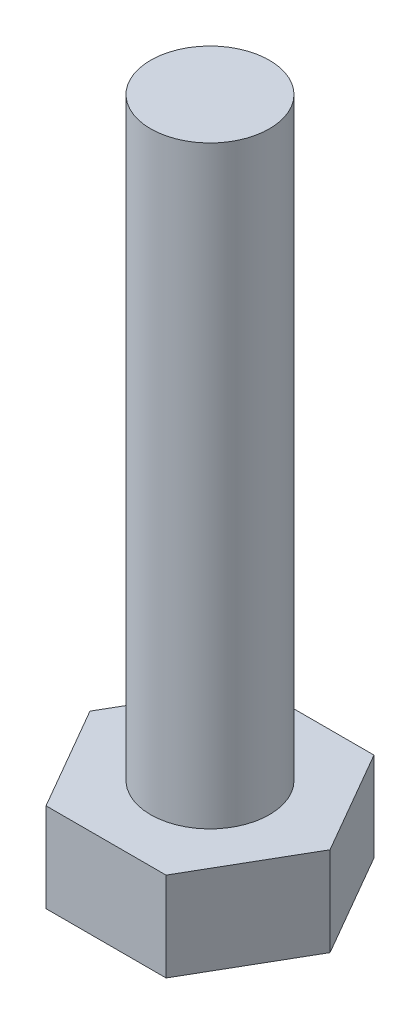
ISO-10303-21;
HEADER;
FILE_DESCRIPTION(('STEP AP214'),'2;1');
FILE_NAME('part.step','',(''),(''),'','','');
FILE_SCHEMA(('AUTOMOTIVE_DESIGN { 1 0 10303 214 1 1 1 1 }'));
ENDSEC;
DATA;
#1=APPLICATION_CONTEXT('core data for automotive mechanical design processes');
#2=APPLICATION_PROTOCOL_DEFINITION('international standard','automotive_design',2000,#1);
#3=PRODUCT_CONTEXT('',#1,'mechanical');
#4=PRODUCT('Part','Part','',(#3));
#5=PRODUCT_RELATED_PRODUCT_CATEGORY('part','',(#4));
#6=PRODUCT_DEFINITION_FORMATION('','',#4);
#7=PRODUCT_DEFINITION_CONTEXT('part definition',#1,'design');
#8=PRODUCT_DEFINITION('design','',#6,#7);
#9=PRODUCT_DEFINITION_SHAPE('','',#8);
#10=(LENGTH_UNIT() NAMED_UNIT(*) SI_UNIT(.MILLI.,.METRE.));
#11=(NAMED_UNIT(*) PLANE_ANGLE_UNIT() SI_UNIT($,.RADIAN.));
#12=(NAMED_UNIT(*) SI_UNIT($,.STERADIAN.) SOLID_ANGLE_UNIT());
#13=UNCERTAINTY_MEASURE_WITH_UNIT(LENGTH_MEASURE(1.E-05),#10,'distance_accuracy_value','');
#14=(GEOMETRIC_REPRESENTATION_CONTEXT(3) GLOBAL_UNCERTAINTY_ASSIGNED_CONTEXT((#13)) GLOBAL_UNIT_ASSIGNED_CONTEXT((#10,
#11,#12)) REPRESENTATION_CONTEXT('',''));
#15=CARTESIAN_POINT('',(0.,0.,0.));
#16=DIRECTION('',(0.,0.,1.));
#17=DIRECTION('',(1.,0.,0.));
#18=AXIS2_PLACEMENT_3D('',#15,#16,#17);
#19=CARTESIAN_POINT('',(-2.02072594216373,3.,-3.49999999999998));
#20=DIRECTION('',(0.866025403784441,0.,0.499999999999995));
#21=DIRECTION('',(0.499999999999995,0.,-0.866025403784441));
#22=AXIS2_PLACEMENT_3D('',#19,#20,#21);
#23=PLANE('',#22);
#24=DIRECTION('',(-0.499999999999995,0.,0.866025403784441));
#25=VECTOR('',#24,1.);
#26=CARTESIAN_POINT('',(-2.02072594216373,0.,-3.49999999999998));
#27=LINE('',#26,#25);
#28=CARTESIAN_POINT('',(-2.02072594216373,0.,-3.49999999999998));
#29=VERTEX_POINT('',#28);
#30=CARTESIAN_POINT('',(-4.04145188432738,0.,0.));
#31=VERTEX_POINT('',#30);
#32=EDGE_CURVE('E136',#29,#31,#27,.T.);
#33=ORIENTED_EDGE('',*,*,#32,.T.);
#34=DIRECTION('',(0.,-1.,0.));
#35=VECTOR('',#34,1.);
#36=CARTESIAN_POINT('',(-4.04145188432738,3.,0.));
#37=LINE('',#36,#35);
#38=CARTESIAN_POINT('',(-4.04145188432738,3.,0.));
#39=VERTEX_POINT('',#38);
#40=EDGE_CURVE('E48',#39,#31,#37,.T.);
#41=ORIENTED_EDGE('',*,*,#40,.F.);
#42=DIRECTION('',(-0.499999999999995,0.,0.866025403784441));
#43=VECTOR('',#42,1.);
#44=CARTESIAN_POINT('',(-2.02072594216373,3.,-3.49999999999998));
#45=LINE('',#44,#43);
#46=CARTESIAN_POINT('',(-2.02072594216373,3.,-3.49999999999998));
#47=VERTEX_POINT('',#46);
#48=EDGE_CURVE('E153',#47,#39,#45,.T.);
#49=ORIENTED_EDGE('',*,*,#48,.F.);
#50=DIRECTION('',(0.,-1.,0.));
#51=VECTOR('',#50,1.);
#52=CARTESIAN_POINT('',(-2.02072594216373,3.,-3.49999999999998));
#53=LINE('',#52,#51);
#54=EDGE_CURVE('E132',#47,#29,#53,.T.);
#55=ORIENTED_EDGE('',*,*,#54,.T.);
#56=EDGE_LOOP('',(#33,#41,#49,#55));
#57=FACE_BOUND('',#56,.T.);
#58=ADVANCED_FACE('F45',(#57),#23,.F.);
#59=CARTESIAN_POINT('',(-4.04145188432738,3.,0.));
#60=DIRECTION('',(0.866025403784438,0.,-0.500000000000001));
#61=DIRECTION('',(-0.500000000000001,0.,-0.866025403784438));
#62=AXIS2_PLACEMENT_3D('',#59,#60,#61);
#63=PLANE('',#62);
#64=DIRECTION('',(0.500000000000001,0.,0.866025403784438));
#65=VECTOR('',#64,1.);
#66=CARTESIAN_POINT('',(-4.04145188432738,0.,0.));
#67=LINE('',#66,#65);
#68=CARTESIAN_POINT('',(-2.02072594216368,0.,3.50000000000001));
#69=VERTEX_POINT('',#68);
#70=EDGE_CURVE('E140',#31,#69,#67,.T.);
#71=ORIENTED_EDGE('',*,*,#70,.T.);
#72=DIRECTION('',(0.,-1.,0.));
#73=VECTOR('',#72,1.);
#74=CARTESIAN_POINT('',(-2.02072594216368,3.,3.50000000000001));
#75=LINE('',#74,#73);
#76=CARTESIAN_POINT('',(-2.02072594216368,3.,3.50000000000001));
#77=VERTEX_POINT('',#76);
#78=EDGE_CURVE('E159',#77,#69,#75,.T.);
#79=ORIENTED_EDGE('',*,*,#78,.F.);
#80=DIRECTION('',(0.500000000000001,0.,0.866025403784438));
#81=VECTOR('',#80,1.);
#82=CARTESIAN_POINT('',(-4.04145188432738,3.,0.));
#83=LINE('',#82,#81);
#84=EDGE_CURVE('E101',#39,#77,#83,.T.);
#85=ORIENTED_EDGE('',*,*,#84,.F.);
#86=ORIENTED_EDGE('',*,*,#40,.T.);
#87=EDGE_LOOP('',(#71,#79,#85,#86));
#88=FACE_BOUND('',#87,.T.);
#89=ADVANCED_FACE('F166',(#88),#63,.F.);
#90=CARTESIAN_POINT('',(-2.02072594216368,3.,3.50000000000001));
#91=DIRECTION('',(0.,0.,-1.));
#92=DIRECTION('',(-1.,0.,0.));
#93=AXIS2_PLACEMENT_3D('',#90,#91,#92);
#94=PLANE('',#93);
#95=DIRECTION('',(1.,0.,0.));
#96=VECTOR('',#95,1.);
#97=CARTESIAN_POINT('',(-2.02072594216368,0.,3.50000000000001));
#98=LINE('',#97,#96);
#99=CARTESIAN_POINT('',(2.02072594216371,0.,3.49999999999999));
#100=VERTEX_POINT('',#99);
#101=EDGE_CURVE('E144',#69,#100,#98,.T.);
#102=ORIENTED_EDGE('',*,*,#101,.T.);
#103=DIRECTION('',(0.,-1.,0.));
#104=VECTOR('',#103,1.);
#105=CARTESIAN_POINT('',(2.02072594216371,3.,3.49999999999999));
#106=LINE('',#105,#104);
#107=CARTESIAN_POINT('',(2.02072594216371,3.,3.49999999999999));
#108=VERTEX_POINT('',#107);
#109=EDGE_CURVE('E125',#108,#100,#106,.T.);
#110=ORIENTED_EDGE('',*,*,#109,.F.);
#111=DIRECTION('',(1.,0.,0.));
#112=VECTOR('',#111,1.);
#113=CARTESIAN_POINT('',(-2.02072594216368,3.,3.50000000000001));
#114=LINE('',#113,#112);
#115=EDGE_CURVE('E114',#77,#108,#114,.T.);
#116=ORIENTED_EDGE('',*,*,#115,.F.);
#117=ORIENTED_EDGE('',*,*,#78,.T.);
#118=EDGE_LOOP('',(#102,#110,#116,#117));
#119=FACE_BOUND('',#118,.T.);
#120=ADVANCED_FACE('F172',(#119),#94,.F.);
#121=CARTESIAN_POINT('',(2.02072594216371,3.,3.49999999999999));
#122=DIRECTION('',(-0.866025403784442,0.,-0.499999999999995));
#123=DIRECTION('',(-0.499999999999995,0.,0.866025403784442));
#124=AXIS2_PLACEMENT_3D('',#121,#122,#123);
#125=PLANE('',#124);
#126=DIRECTION('',(0.499999999999995,0.,-0.866025403784441));
#127=VECTOR('',#126,1.);
#128=CARTESIAN_POINT('',(2.02072594216371,0.,3.49999999999999));
#129=LINE('',#128,#127);
#130=CARTESIAN_POINT('',(4.04145188432738,0.,0.));
#131=VERTEX_POINT('',#130);
#132=EDGE_CURVE('E123',#100,#131,#129,.T.);
#133=ORIENTED_EDGE('',*,*,#132,.T.);
#134=DIRECTION('',(0.,-1.,0.));
#135=VECTOR('',#134,1.);
#136=CARTESIAN_POINT('',(4.04145188432738,3.,0.));
#137=LINE('',#136,#135);
#138=CARTESIAN_POINT('',(4.04145188432738,3.,0.));
#139=VERTEX_POINT('',#138);
#140=EDGE_CURVE('E120',#139,#131,#137,.T.);
#141=ORIENTED_EDGE('',*,*,#140,.F.);
#142=DIRECTION('',(0.499999999999995,0.,-0.866025403784441));
#143=VECTOR('',#142,1.);
#144=CARTESIAN_POINT('',(2.02072594216371,3.,3.49999999999999));
#145=LINE('',#144,#143);
#146=EDGE_CURVE('E108',#108,#139,#145,.T.);
#147=ORIENTED_EDGE('',*,*,#146,.F.);
#148=ORIENTED_EDGE('',*,*,#109,.T.);
#149=EDGE_LOOP('',(#133,#141,#147,#148));
#150=FACE_BOUND('',#149,.T.);
#151=ADVANCED_FACE('F121',(#150),#125,.F.);
#152=CARTESIAN_POINT('',(4.04145188432738,3.,0.));
#153=DIRECTION('',(-0.866025403784434,0.,0.500000000000007));
#154=DIRECTION('',(0.500000000000007,0.,0.866025403784435));
#155=AXIS2_PLACEMENT_3D('',#152,#153,#154);
#156=PLANE('',#155);
#157=DIRECTION('',(-0.500000000000007,0.,-0.866025403784434));
#158=VECTOR('',#157,1.);
#159=CARTESIAN_POINT('',(4.04145188432738,0.,0.));
#160=LINE('',#159,#158);
#161=CARTESIAN_POINT('',(2.02072594216366,0.,-3.50000000000002));
#162=VERTEX_POINT('',#161);
#163=EDGE_CURVE('E86',#131,#162,#160,.T.);
#164=ORIENTED_EDGE('',*,*,#163,.T.);
#165=DIRECTION('',(0.,-1.,0.));
#166=VECTOR('',#165,1.);
#167=CARTESIAN_POINT('',(2.02072594216366,3.,-3.50000000000002));
#168=LINE('',#167,#166);
#169=CARTESIAN_POINT('',(2.02072594216366,3.,-3.50000000000002));
#170=VERTEX_POINT('',#169);
#171=EDGE_CURVE('E126',#170,#162,#168,.T.);
#172=ORIENTED_EDGE('',*,*,#171,.F.);
#173=DIRECTION('',(-0.500000000000007,0.,-0.866025403784434));
#174=VECTOR('',#173,1.);
#175=CARTESIAN_POINT('',(4.04145188432738,3.,0.));
#176=LINE('',#175,#174);
#177=EDGE_CURVE('E112',#139,#170,#176,.T.);
#178=ORIENTED_EDGE('',*,*,#177,.F.);
#179=ORIENTED_EDGE('',*,*,#140,.T.);
#180=EDGE_LOOP('',(#164,#172,#178,#179));
#181=FACE_BOUND('',#180,.T.);
#182=ADVANCED_FACE('F128',(#181),#156,.F.);
#183=CARTESIAN_POINT('',(2.02072594216366,3.,-3.50000000000002));
#184=DIRECTION('',(0.,0.,1.));
#185=DIRECTION('',(1.,0.,0.));
#186=AXIS2_PLACEMENT_3D('',#183,#184,#185);
#187=PLANE('',#186);
#188=DIRECTION('',(-1.,0.,0.));
#189=VECTOR('',#188,1.);
#190=CARTESIAN_POINT('',(2.02072594216366,0.,-3.50000000000002));
#191=LINE('',#190,#189);
#192=EDGE_CURVE('E92',#162,#29,#191,.T.);
#193=ORIENTED_EDGE('',*,*,#192,.T.);
#194=ORIENTED_EDGE('',*,*,#54,.F.);
#195=DIRECTION('',(-1.,0.,0.));
#196=VECTOR('',#195,1.);
#197=CARTESIAN_POINT('',(2.02072594216366,3.,-3.50000000000002));
#198=LINE('',#197,#196);
#199=EDGE_CURVE('E63',#170,#47,#198,.T.);
#200=ORIENTED_EDGE('',*,*,#199,.F.);
#201=ORIENTED_EDGE('',*,*,#171,.T.);
#202=EDGE_LOOP('',(#193,#194,#200,#201));
#203=FACE_BOUND('',#202,.T.);
#204=ADVANCED_FACE('F192',(#203),#187,.F.);
#205=CARTESIAN_POINT('',(0.,3.,0.));
#206=DIRECTION('',(0.,1.,0.));
#207=DIRECTION('',(0.,0.,1.));
#208=AXIS2_PLACEMENT_3D('',#205,#206,#207);
#209=PLANE('',#208);
#210=CARTESIAN_POINT('',(0.,3.,0.));
#211=DIRECTION('',(0.,1.,0.));
#212=DIRECTION('',(0.,0.,1.));
#213=AXIS2_PLACEMENT_3D('',#210,#211,#212);
#214=CIRCLE('',#213,2.);
#215=CARTESIAN_POINT('',(0.,3.,2.));
#216=VERTEX_POINT('',#215);
#217=EDGE_CURVE('E11',#216,#216,#214,.T.);
#218=ORIENTED_EDGE('',*,*,#217,.F.);
#219=EDGE_LOOP('',(#218));
#220=FACE_BOUND('',#219,.T.);
#221=ORIENTED_EDGE('',*,*,#48,.T.);
#222=ORIENTED_EDGE('',*,*,#84,.T.);
#223=ORIENTED_EDGE('',*,*,#115,.T.);
#224=ORIENTED_EDGE('',*,*,#146,.T.);
#225=ORIENTED_EDGE('',*,*,#177,.T.);
#226=ORIENTED_EDGE('',*,*,#199,.T.);
#227=EDGE_LOOP('',(#221,#222,#223,#224,#225,#226));
#228=FACE_BOUND('',#227,.T.);
#229=ADVANCED_FACE('F110',(#220,#228),#209,.T.);
#230=CARTESIAN_POINT('',(0.,0.,0.));
#231=DIRECTION('',(0.,1.,0.));
#232=DIRECTION('',(0.,0.,1.));
#233=AXIS2_PLACEMENT_3D('',#230,#231,#232);
#234=PLANE('',#233);
#235=ORIENTED_EDGE('',*,*,#32,.F.);
#236=ORIENTED_EDGE('',*,*,#192,.F.);
#237=ORIENTED_EDGE('',*,*,#163,.F.);
#238=ORIENTED_EDGE('',*,*,#132,.F.);
#239=ORIENTED_EDGE('',*,*,#101,.F.);
#240=ORIENTED_EDGE('',*,*,#70,.F.);
#241=EDGE_LOOP('',(#235,#236,#237,#238,#239,#240));
#242=FACE_BOUND('',#241,.T.);
#243=ADVANCED_FACE('F171',(#242),#234,.F.);
#244=CARTESIAN_POINT('',(0.,23.,0.));
#245=DIRECTION('',(0.,-1.,0.));
#246=DIRECTION('',(0.,0.,-1.));
#247=AXIS2_PLACEMENT_3D('',#244,#245,#246);
#248=CYLINDRICAL_SURFACE('',#247,2.);
#249=CARTESIAN_POINT('',(0.,23.,0.));
#250=DIRECTION('',(0.,1.,0.));
#251=DIRECTION('',(0.,0.,1.));
#252=AXIS2_PLACEMENT_3D('',#249,#250,#251);
#253=CIRCLE('',#252,2.);
#254=CARTESIAN_POINT('',(0.,23.,2.));
#255=VERTEX_POINT('',#254);
#256=EDGE_CURVE('E141',#255,#255,#253,.T.);
#257=ORIENTED_EDGE('',*,*,#256,.F.);
#258=EDGE_LOOP('',(#257));
#259=FACE_BOUND('',#258,.T.);
#260=ORIENTED_EDGE('',*,*,#217,.T.);
#261=EDGE_LOOP('',(#260));
#262=FACE_BOUND('',#261,.T.);
#263=ADVANCED_FACE('F185',(#259,#262),#248,.T.);
#264=CARTESIAN_POINT('',(0.,23.,0.));
#265=DIRECTION('',(0.,1.,0.));
#266=DIRECTION('',(0.,0.,1.));
#267=AXIS2_PLACEMENT_3D('',#264,#265,#266);
#268=PLANE('',#267);
#269=ORIENTED_EDGE('',*,*,#256,.T.);
#270=EDGE_LOOP('',(#269));
#271=FACE_BOUND('',#270,.T.);
#272=ADVANCED_FACE('F183',(#271),#268,.T.);
#273=CLOSED_SHELL('',(#58,#89,#120,#151,#182,#204,#229,#243,#263,#272));
#274=MANIFOLD_SOLID_BREP('B2',#273);
#275=ADVANCED_BREP_SHAPE_REPRESENTATION('',(#18,#274),#14);
#276=SHAPE_DEFINITION_REPRESENTATION(#9,#275);
ENDSEC;
END-ISO-10303-21;
